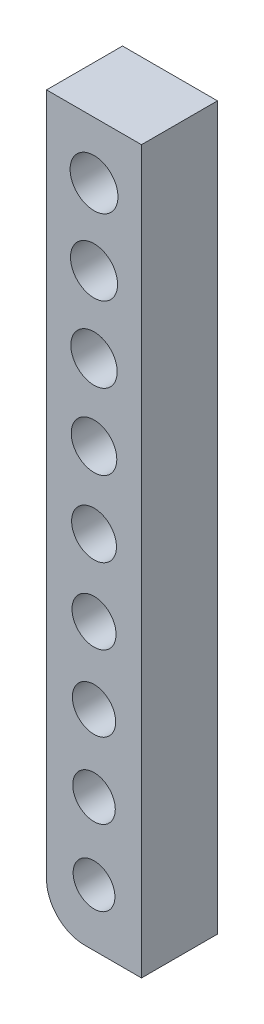
ISO-10303-21;
HEADER;
FILE_DESCRIPTION(('STEP AP214'),'2;1');
FILE_NAME('part.step','',(''),(''),'','','');
FILE_SCHEMA(('AUTOMOTIVE_DESIGN { 1 0 10303 214 1 1 1 1 }'));
ENDSEC;
DATA;
#1=APPLICATION_CONTEXT('core data for automotive mechanical design processes');
#2=APPLICATION_PROTOCOL_DEFINITION('international standard','automotive_design',2000,#1);
#3=PRODUCT_CONTEXT('',#1,'mechanical');
#4=PRODUCT('Part','Part','',(#3));
#5=PRODUCT_RELATED_PRODUCT_CATEGORY('part','',(#4));
#6=PRODUCT_DEFINITION_FORMATION('','',#4);
#7=PRODUCT_DEFINITION_CONTEXT('part definition',#1,'design');
#8=PRODUCT_DEFINITION('design','',#6,#7);
#9=PRODUCT_DEFINITION_SHAPE('','',#8);
#10=(LENGTH_UNIT() NAMED_UNIT(*) SI_UNIT(.MILLI.,.METRE.));
#11=(NAMED_UNIT(*) PLANE_ANGLE_UNIT() SI_UNIT($,.RADIAN.));
#12=(NAMED_UNIT(*) SI_UNIT($,.STERADIAN.) SOLID_ANGLE_UNIT());
#13=UNCERTAINTY_MEASURE_WITH_UNIT(LENGTH_MEASURE(1.E-05),#10,'distance_accuracy_value','');
#14=(GEOMETRIC_REPRESENTATION_CONTEXT(3) GLOBAL_UNCERTAINTY_ASSIGNED_CONTEXT((#13)) GLOBAL_UNIT_ASSIGNED_CONTEXT((#10,
#11,#12)) REPRESENTATION_CONTEXT('',''));
#15=CARTESIAN_POINT('',(0.,0.,0.));
#16=DIRECTION('',(0.,0.,1.));
#17=DIRECTION('',(1.,0.,0.));
#18=AXIS2_PLACEMENT_3D('',#15,#16,#17);
#19=CARTESIAN_POINT('',(0.,0.,5.08));
#20=DIRECTION('',(0.,0.,-1.));
#21=DIRECTION('',(-1.,0.,0.));
#22=AXIS2_PLACEMENT_3D('',#19,#20,#21);
#23=PLANE('',#22);
#24=DIRECTION('',(0.,-1.,0.));
#25=VECTOR('',#24,1.);
#26=CARTESIAN_POINT('',(-6.35,0.,5.08));
#27=LINE('',#26,#25);
#28=CARTESIAN_POINT('',(-6.35,48.26,5.08));
#29=VERTEX_POINT('',#28);
#30=CARTESIAN_POINT('',(-6.35,2.54,5.08));
#31=VERTEX_POINT('',#30);
#32=EDGE_CURVE('E133',#29,#31,#27,.T.);
#33=ORIENTED_EDGE('',*,*,#32,.T.);
#34=CARTESIAN_POINT('',(-3.81,2.54,5.08));
#35=DIRECTION('',(0.,0.,-1.));
#36=DIRECTION('',(-1.,0.,0.));
#37=AXIS2_PLACEMENT_3D('',#34,#35,#36);
#38=CIRCLE('',#37,2.54);
#39=CARTESIAN_POINT('',(-3.81,0.,5.08));
#40=VERTEX_POINT('',#39);
#41=EDGE_CURVE('E11',#31,#40,#38,.F.);
#42=ORIENTED_EDGE('',*,*,#41,.T.);
#43=DIRECTION('',(1.,0.,0.));
#44=VECTOR('',#43,1.);
#45=CARTESIAN_POINT('',(0.,0.,5.08));
#46=LINE('',#45,#44);
#47=CARTESIAN_POINT('',(0.,0.,5.08));
#48=VERTEX_POINT('',#47);
#49=EDGE_CURVE('E92',#40,#48,#46,.T.);
#50=ORIENTED_EDGE('',*,*,#49,.T.);
#51=DIRECTION('',(0.,1.,0.));
#52=VECTOR('',#51,1.);
#53=CARTESIAN_POINT('',(0.,0.,5.08));
#54=LINE('',#53,#52);
#55=CARTESIAN_POINT('',(0.,48.26,5.08));
#56=VERTEX_POINT('',#55);
#57=EDGE_CURVE('E95',#48,#56,#54,.T.);
#58=ORIENTED_EDGE('',*,*,#57,.T.);
#59=DIRECTION('',(-1.,0.,0.));
#60=VECTOR('',#59,1.);
#61=CARTESIAN_POINT('',(0.,48.26,5.08));
#62=LINE('',#61,#60);
#63=EDGE_CURVE('E113',#56,#29,#62,.T.);
#64=ORIENTED_EDGE('',*,*,#63,.T.);
#65=EDGE_LOOP('',(#33,#42,#50,#58,#64));
#66=FACE_BOUND('',#65,.T.);
#67=CARTESIAN_POINT('',(-3.175,3.81,5.08));
#68=DIRECTION('',(0.,0.,1.));
#69=DIRECTION('',(1.,0.,0.));
#70=AXIS2_PLACEMENT_3D('',#67,#68,#69);
#71=CIRCLE('',#70,1.397);
#72=CARTESIAN_POINT('',(-1.778,3.81,5.08));
#73=VERTEX_POINT('',#72);
#74=EDGE_CURVE('E144',#73,#73,#71,.T.);
#75=ORIENTED_EDGE('',*,*,#74,.F.);
#76=EDGE_LOOP('',(#75));
#77=FACE_BOUND('',#76,.T.);
#78=CARTESIAN_POINT('',(-3.175,8.89,5.08));
#79=DIRECTION('',(0.,0.,1.));
#80=DIRECTION('',(1.,0.,0.));
#81=AXIS2_PLACEMENT_3D('',#78,#79,#80);
#82=CIRCLE('',#81,1.4224);
#83=CARTESIAN_POINT('',(-1.7526,8.89,5.08));
#84=VERTEX_POINT('',#83);
#85=EDGE_CURVE('E153',#84,#84,#82,.T.);
#86=ORIENTED_EDGE('',*,*,#85,.F.);
#87=EDGE_LOOP('',(#86));
#88=FACE_BOUND('',#87,.T.);
#89=CARTESIAN_POINT('',(-3.175,13.97,5.08));
#90=DIRECTION('',(0.,0.,1.));
#91=DIRECTION('',(1.,0.,0.));
#92=AXIS2_PLACEMENT_3D('',#89,#90,#91);
#93=CIRCLE('',#92,1.4478);
#94=CARTESIAN_POINT('',(-1.7272,13.97,5.08));
#95=VERTEX_POINT('',#94);
#96=EDGE_CURVE('E161',#95,#95,#93,.T.);
#97=ORIENTED_EDGE('',*,*,#96,.F.);
#98=EDGE_LOOP('',(#97));
#99=FACE_BOUND('',#98,.T.);
#100=CARTESIAN_POINT('',(-3.175,19.05,5.08));
#101=DIRECTION('',(0.,0.,1.));
#102=DIRECTION('',(1.,0.,0.));
#103=AXIS2_PLACEMENT_3D('',#100,#101,#102);
#104=CIRCLE('',#103,1.4732);
#105=CARTESIAN_POINT('',(-1.7018,19.05,5.08));
#106=VERTEX_POINT('',#105);
#107=EDGE_CURVE('E169',#106,#106,#104,.T.);
#108=ORIENTED_EDGE('',*,*,#107,.F.);
#109=EDGE_LOOP('',(#108));
#110=FACE_BOUND('',#109,.T.);
#111=CARTESIAN_POINT('',(-3.175,24.13,5.08));
#112=DIRECTION('',(0.,0.,1.));
#113=DIRECTION('',(1.,0.,0.));
#114=AXIS2_PLACEMENT_3D('',#111,#112,#113);
#115=CIRCLE('',#114,1.4986);
#116=CARTESIAN_POINT('',(-1.6764,24.13,5.08));
#117=VERTEX_POINT('',#116);
#118=EDGE_CURVE('E177',#117,#117,#115,.T.);
#119=ORIENTED_EDGE('',*,*,#118,.F.);
#120=EDGE_LOOP('',(#119));
#121=FACE_BOUND('',#120,.T.);
#122=CARTESIAN_POINT('',(-3.175,29.21,5.08));
#123=DIRECTION('',(0.,0.,1.));
#124=DIRECTION('',(1.,0.,0.));
#125=AXIS2_PLACEMENT_3D('',#122,#123,#124);
#126=CIRCLE('',#125,1.524);
#127=CARTESIAN_POINT('',(-1.651,29.21,5.08));
#128=VERTEX_POINT('',#127);
#129=EDGE_CURVE('E185',#128,#128,#126,.T.);
#130=ORIENTED_EDGE('',*,*,#129,.F.);
#131=EDGE_LOOP('',(#130));
#132=FACE_BOUND('',#131,.T.);
#133=CARTESIAN_POINT('',(-3.175,34.29,5.08));
#134=DIRECTION('',(0.,0.,1.));
#135=DIRECTION('',(1.,0.,0.));
#136=AXIS2_PLACEMENT_3D('',#133,#134,#135);
#137=CIRCLE('',#136,1.5494);
#138=CARTESIAN_POINT('',(-1.6256,34.29,5.08));
#139=VERTEX_POINT('',#138);
#140=EDGE_CURVE('E193',#139,#139,#137,.T.);
#141=ORIENTED_EDGE('',*,*,#140,.F.);
#142=EDGE_LOOP('',(#141));
#143=FACE_BOUND('',#142,.T.);
#144=CARTESIAN_POINT('',(-3.175,39.37,5.08));
#145=DIRECTION('',(0.,0.,1.));
#146=DIRECTION('',(1.,0.,0.));
#147=AXIS2_PLACEMENT_3D('',#144,#145,#146);
#148=CIRCLE('',#147,1.5748);
#149=CARTESIAN_POINT('',(-1.6002,39.37,5.08));
#150=VERTEX_POINT('',#149);
#151=EDGE_CURVE('E201',#150,#150,#148,.T.);
#152=ORIENTED_EDGE('',*,*,#151,.F.);
#153=EDGE_LOOP('',(#152));
#154=FACE_BOUND('',#153,.T.);
#155=CARTESIAN_POINT('',(-3.175,44.45,5.08));
#156=DIRECTION('',(0.,0.,1.));
#157=DIRECTION('',(1.,0.,0.));
#158=AXIS2_PLACEMENT_3D('',#155,#156,#157);
#159=CIRCLE('',#158,1.6002);
#160=CARTESIAN_POINT('',(-1.5748,44.45,5.08));
#161=VERTEX_POINT('',#160);
#162=EDGE_CURVE('E209',#161,#161,#159,.T.);
#163=ORIENTED_EDGE('',*,*,#162,.F.);
#164=EDGE_LOOP('',(#163));
#165=FACE_BOUND('',#164,.T.);
#166=ADVANCED_FACE('F45',(#66,#77,#88,#99,#110,#121,#132,#143,#154,#165),#23,.F.);
#167=CARTESIAN_POINT('',(0.,0.,0.));
#168=DIRECTION('',(0.,0.,-1.));
#169=DIRECTION('',(-1.,0.,0.));
#170=AXIS2_PLACEMENT_3D('',#167,#168,#169);
#171=PLANE('',#170);
#172=CARTESIAN_POINT('',(-3.175,39.37,0.));
#173=DIRECTION('',(0.,0.,1.));
#174=DIRECTION('',(1.,0.,0.));
#175=AXIS2_PLACEMENT_3D('',#172,#173,#174);
#176=CIRCLE('',#175,1.5748);
#177=CARTESIAN_POINT('',(-1.6002,39.37,0.));
#178=VERTEX_POINT('',#177);
#179=EDGE_CURVE('E205',#178,#178,#176,.T.);
#180=ORIENTED_EDGE('',*,*,#179,.T.);
#181=EDGE_LOOP('',(#180));
#182=FACE_BOUND('',#181,.T.);
#183=CARTESIAN_POINT('',(-3.175,29.21,0.));
#184=DIRECTION('',(0.,0.,1.));
#185=DIRECTION('',(1.,0.,0.));
#186=AXIS2_PLACEMENT_3D('',#183,#184,#185);
#187=CIRCLE('',#186,1.524);
#188=CARTESIAN_POINT('',(-1.651,29.21,0.));
#189=VERTEX_POINT('',#188);
#190=EDGE_CURVE('E189',#189,#189,#187,.T.);
#191=ORIENTED_EDGE('',*,*,#190,.T.);
#192=EDGE_LOOP('',(#191));
#193=FACE_BOUND('',#192,.T.);
#194=CARTESIAN_POINT('',(-3.175,19.05,0.));
#195=DIRECTION('',(0.,0.,1.));
#196=DIRECTION('',(1.,0.,0.));
#197=AXIS2_PLACEMENT_3D('',#194,#195,#196);
#198=CIRCLE('',#197,1.4732);
#199=CARTESIAN_POINT('',(-1.7018,19.05,0.));
#200=VERTEX_POINT('',#199);
#201=EDGE_CURVE('E173',#200,#200,#198,.T.);
#202=ORIENTED_EDGE('',*,*,#201,.T.);
#203=EDGE_LOOP('',(#202));
#204=FACE_BOUND('',#203,.T.);
#205=CARTESIAN_POINT('',(-3.175,8.89,0.));
#206=DIRECTION('',(0.,0.,1.));
#207=DIRECTION('',(1.,0.,0.));
#208=AXIS2_PLACEMENT_3D('',#205,#206,#207);
#209=CIRCLE('',#208,1.4224);
#210=CARTESIAN_POINT('',(-1.7526,8.89,0.));
#211=VERTEX_POINT('',#210);
#212=EDGE_CURVE('E157',#211,#211,#209,.T.);
#213=ORIENTED_EDGE('',*,*,#212,.T.);
#214=EDGE_LOOP('',(#213));
#215=FACE_BOUND('',#214,.T.);
#216=DIRECTION('',(1.,0.,0.));
#217=VECTOR('',#216,1.);
#218=CARTESIAN_POINT('',(0.,0.,0.));
#219=LINE('',#218,#217);
#220=CARTESIAN_POINT('',(-3.81,0.,0.));
#221=VERTEX_POINT('',#220);
#222=CARTESIAN_POINT('',(0.,0.,0.));
#223=VERTEX_POINT('',#222);
#224=EDGE_CURVE('E116',#221,#223,#219,.T.);
#225=ORIENTED_EDGE('',*,*,#224,.F.);
#226=CARTESIAN_POINT('',(-3.81,2.54,0.));
#227=DIRECTION('',(0.,0.,-1.));
#228=DIRECTION('',(-1.,0.,0.));
#229=AXIS2_PLACEMENT_3D('',#226,#227,#228);
#230=CIRCLE('',#229,2.54);
#231=CARTESIAN_POINT('',(-6.35,2.54,0.));
#232=VERTEX_POINT('',#231);
#233=EDGE_CURVE('E68',#221,#232,#230,.T.);
#234=ORIENTED_EDGE('',*,*,#233,.T.);
#235=DIRECTION('',(0.,-1.,0.));
#236=VECTOR('',#235,1.);
#237=CARTESIAN_POINT('',(-6.35,0.,0.));
#238=LINE('',#237,#236);
#239=CARTESIAN_POINT('',(-6.35,48.26,0.));
#240=VERTEX_POINT('',#239);
#241=EDGE_CURVE('E103',#240,#232,#238,.T.);
#242=ORIENTED_EDGE('',*,*,#241,.F.);
#243=DIRECTION('',(-1.,0.,0.));
#244=VECTOR('',#243,1.);
#245=CARTESIAN_POINT('',(0.,48.26,0.));
#246=LINE('',#245,#244);
#247=CARTESIAN_POINT('',(0.,48.26,0.));
#248=VERTEX_POINT('',#247);
#249=EDGE_CURVE('E136',#248,#240,#246,.T.);
#250=ORIENTED_EDGE('',*,*,#249,.F.);
#251=DIRECTION('',(0.,1.,0.));
#252=VECTOR('',#251,1.);
#253=CARTESIAN_POINT('',(0.,0.,0.));
#254=LINE('',#253,#252);
#255=EDGE_CURVE('E139',#223,#248,#254,.T.);
#256=ORIENTED_EDGE('',*,*,#255,.F.);
#257=EDGE_LOOP('',(#225,#234,#242,#250,#256));
#258=FACE_BOUND('',#257,.T.);
#259=CARTESIAN_POINT('',(-3.175,3.81,0.));
#260=DIRECTION('',(0.,0.,1.));
#261=DIRECTION('',(1.,0.,0.));
#262=AXIS2_PLACEMENT_3D('',#259,#260,#261);
#263=CIRCLE('',#262,1.397);
#264=CARTESIAN_POINT('',(-1.778,3.81,0.));
#265=VERTEX_POINT('',#264);
#266=EDGE_CURVE('E149',#265,#265,#263,.T.);
#267=ORIENTED_EDGE('',*,*,#266,.T.);
#268=EDGE_LOOP('',(#267));
#269=FACE_BOUND('',#268,.T.);
#270=CARTESIAN_POINT('',(-3.175,13.97,0.));
#271=DIRECTION('',(0.,0.,1.));
#272=DIRECTION('',(1.,0.,0.));
#273=AXIS2_PLACEMENT_3D('',#270,#271,#272);
#274=CIRCLE('',#273,1.4478);
#275=CARTESIAN_POINT('',(-1.7272,13.97,0.));
#276=VERTEX_POINT('',#275);
#277=EDGE_CURVE('E165',#276,#276,#274,.T.);
#278=ORIENTED_EDGE('',*,*,#277,.T.);
#279=EDGE_LOOP('',(#278));
#280=FACE_BOUND('',#279,.T.);
#281=CARTESIAN_POINT('',(-3.175,24.13,0.));
#282=DIRECTION('',(0.,0.,1.));
#283=DIRECTION('',(1.,0.,0.));
#284=AXIS2_PLACEMENT_3D('',#281,#282,#283);
#285=CIRCLE('',#284,1.4986);
#286=CARTESIAN_POINT('',(-1.6764,24.13,0.));
#287=VERTEX_POINT('',#286);
#288=EDGE_CURVE('E181',#287,#287,#285,.T.);
#289=ORIENTED_EDGE('',*,*,#288,.T.);
#290=EDGE_LOOP('',(#289));
#291=FACE_BOUND('',#290,.T.);
#292=CARTESIAN_POINT('',(-3.175,34.29,0.));
#293=DIRECTION('',(0.,0.,1.));
#294=DIRECTION('',(1.,0.,0.));
#295=AXIS2_PLACEMENT_3D('',#292,#293,#294);
#296=CIRCLE('',#295,1.5494);
#297=CARTESIAN_POINT('',(-1.6256,34.29,0.));
#298=VERTEX_POINT('',#297);
#299=EDGE_CURVE('E197',#298,#298,#296,.T.);
#300=ORIENTED_EDGE('',*,*,#299,.T.);
#301=EDGE_LOOP('',(#300));
#302=FACE_BOUND('',#301,.T.);
#303=CARTESIAN_POINT('',(-3.175,44.45,0.));
#304=DIRECTION('',(0.,0.,1.));
#305=DIRECTION('',(1.,0.,0.));
#306=AXIS2_PLACEMENT_3D('',#303,#304,#305);
#307=CIRCLE('',#306,1.6002);
#308=CARTESIAN_POINT('',(-1.5748,44.45,0.));
#309=VERTEX_POINT('',#308);
#310=EDGE_CURVE('E213',#309,#309,#307,.T.);
#311=ORIENTED_EDGE('',*,*,#310,.T.);
#312=EDGE_LOOP('',(#311));
#313=FACE_BOUND('',#312,.T.);
#314=ADVANCED_FACE('F225',(#182,#193,#204,#215,#258,#269,#280,#291,#302,#313),#171,.T.);
#315=CARTESIAN_POINT('',(0.,0.,5.08));
#316=DIRECTION('',(0.,1.,0.));
#317=DIRECTION('',(0.,0.,1.));
#318=AXIS2_PLACEMENT_3D('',#315,#316,#317);
#319=PLANE('',#318);
#320=ORIENTED_EDGE('',*,*,#49,.F.);
#321=DIRECTION('',(0.,0.,-1.));
#322=VECTOR('',#321,1.);
#323=CARTESIAN_POINT('',(-3.81,0.,5.08));
#324=LINE('',#323,#322);
#325=EDGE_CURVE('E119',#40,#221,#324,.T.);
#326=ORIENTED_EDGE('',*,*,#325,.T.);
#327=ORIENTED_EDGE('',*,*,#224,.T.);
#328=DIRECTION('',(0.,0.,-1.));
#329=VECTOR('',#328,1.);
#330=CARTESIAN_POINT('',(0.,0.,5.08));
#331=LINE('',#330,#329);
#332=EDGE_CURVE('E108',#48,#223,#331,.T.);
#333=ORIENTED_EDGE('',*,*,#332,.F.);
#334=EDGE_LOOP('',(#320,#326,#327,#333));
#335=FACE_BOUND('',#334,.T.);
#336=ADVANCED_FACE('F115',(#335),#319,.F.);
#337=CARTESIAN_POINT('',(0.,0.,5.08));
#338=DIRECTION('',(-1.,0.,0.));
#339=DIRECTION('',(0.,0.,1.));
#340=AXIS2_PLACEMENT_3D('',#337,#338,#339);
#341=PLANE('',#340);
#342=ORIENTED_EDGE('',*,*,#255,.T.);
#343=DIRECTION('',(0.,0.,-1.));
#344=VECTOR('',#343,1.);
#345=CARTESIAN_POINT('',(0.,48.26,5.08));
#346=LINE('',#345,#344);
#347=EDGE_CURVE('E110',#56,#248,#346,.T.);
#348=ORIENTED_EDGE('',*,*,#347,.F.);
#349=ORIENTED_EDGE('',*,*,#57,.F.);
#350=ORIENTED_EDGE('',*,*,#332,.T.);
#351=EDGE_LOOP('',(#342,#348,#349,#350));
#352=FACE_BOUND('',#351,.T.);
#353=ADVANCED_FACE('F107',(#352),#341,.F.);
#354=CARTESIAN_POINT('',(0.,48.26,5.08));
#355=DIRECTION('',(0.,-1.,0.));
#356=DIRECTION('',(0.,0.,-1.));
#357=AXIS2_PLACEMENT_3D('',#354,#355,#356);
#358=PLANE('',#357);
#359=ORIENTED_EDGE('',*,*,#249,.T.);
#360=DIRECTION('',(0.,0.,-1.));
#361=VECTOR('',#360,1.);
#362=CARTESIAN_POINT('',(-6.35,48.26,5.08));
#363=LINE('',#362,#361);
#364=EDGE_CURVE('E124',#29,#240,#363,.T.);
#365=ORIENTED_EDGE('',*,*,#364,.F.);
#366=ORIENTED_EDGE('',*,*,#63,.F.);
#367=ORIENTED_EDGE('',*,*,#347,.T.);
#368=EDGE_LOOP('',(#359,#365,#366,#367));
#369=FACE_BOUND('',#368,.T.);
#370=ADVANCED_FACE('F240',(#369),#358,.F.);
#371=CARTESIAN_POINT('',(-6.35,0.,5.08));
#372=DIRECTION('',(1.,0.,0.));
#373=DIRECTION('',(0.,0.,-1.));
#374=AXIS2_PLACEMENT_3D('',#371,#372,#373);
#375=PLANE('',#374);
#376=ORIENTED_EDGE('',*,*,#241,.T.);
#377=DIRECTION('',(0.,0.,-1.));
#378=VECTOR('',#377,1.);
#379=CARTESIAN_POINT('',(-6.35,2.54,5.08));
#380=LINE('',#379,#378);
#381=EDGE_CURVE('E54',#232,#31,#380,.F.);
#382=ORIENTED_EDGE('',*,*,#381,.T.);
#383=ORIENTED_EDGE('',*,*,#32,.F.);
#384=ORIENTED_EDGE('',*,*,#364,.T.);
#385=EDGE_LOOP('',(#376,#382,#383,#384));
#386=FACE_BOUND('',#385,.T.);
#387=ADVANCED_FACE('F237',(#386),#375,.F.);
#388=CARTESIAN_POINT('',(-3.175,3.81,5.08));
#389=DIRECTION('',(0.,0.,-1.));
#390=DIRECTION('',(-1.,0.,0.));
#391=AXIS2_PLACEMENT_3D('',#388,#389,#390);
#392=CYLINDRICAL_SURFACE('',#391,1.397);
#393=ORIENTED_EDGE('',*,*,#74,.T.);
#394=EDGE_LOOP('',(#393));
#395=FACE_BOUND('',#394,.T.);
#396=ORIENTED_EDGE('',*,*,#266,.F.);
#397=EDGE_LOOP('',(#396));
#398=FACE_BOUND('',#397,.T.);
#399=ADVANCED_FACE('F234',(#395,#398),#392,.F.);
#400=CARTESIAN_POINT('',(-3.175,8.89,5.08));
#401=DIRECTION('',(0.,0.,-1.));
#402=DIRECTION('',(-1.,0.,0.));
#403=AXIS2_PLACEMENT_3D('',#400,#401,#402);
#404=CYLINDRICAL_SURFACE('',#403,1.4224);
#405=ORIENTED_EDGE('',*,*,#85,.T.);
#406=EDGE_LOOP('',(#405));
#407=FACE_BOUND('',#406,.T.);
#408=ORIENTED_EDGE('',*,*,#212,.F.);
#409=EDGE_LOOP('',(#408));
#410=FACE_BOUND('',#409,.T.);
#411=ADVANCED_FACE('F333',(#407,#410),#404,.F.);
#412=CARTESIAN_POINT('',(-3.175,13.97,5.08));
#413=DIRECTION('',(0.,0.,-1.));
#414=DIRECTION('',(-1.,0.,0.));
#415=AXIS2_PLACEMENT_3D('',#412,#413,#414);
#416=CYLINDRICAL_SURFACE('',#415,1.4478);
#417=ORIENTED_EDGE('',*,*,#96,.T.);
#418=EDGE_LOOP('',(#417));
#419=FACE_BOUND('',#418,.T.);
#420=ORIENTED_EDGE('',*,*,#277,.F.);
#421=EDGE_LOOP('',(#420));
#422=FACE_BOUND('',#421,.T.);
#423=ADVANCED_FACE('F323',(#419,#422),#416,.F.);
#424=CARTESIAN_POINT('',(-3.175,19.05,5.08));
#425=DIRECTION('',(0.,0.,-1.));
#426=DIRECTION('',(-1.,0.,0.));
#427=AXIS2_PLACEMENT_3D('',#424,#425,#426);
#428=CYLINDRICAL_SURFACE('',#427,1.4732);
#429=ORIENTED_EDGE('',*,*,#107,.T.);
#430=EDGE_LOOP('',(#429));
#431=FACE_BOUND('',#430,.T.);
#432=ORIENTED_EDGE('',*,*,#201,.F.);
#433=EDGE_LOOP('',(#432));
#434=FACE_BOUND('',#433,.T.);
#435=ADVANCED_FACE('F313',(#431,#434),#428,.F.);
#436=CARTESIAN_POINT('',(-3.175,24.13,5.08));
#437=DIRECTION('',(0.,0.,-1.));
#438=DIRECTION('',(-1.,0.,0.));
#439=AXIS2_PLACEMENT_3D('',#436,#437,#438);
#440=CYLINDRICAL_SURFACE('',#439,1.4986);
#441=ORIENTED_EDGE('',*,*,#118,.T.);
#442=EDGE_LOOP('',(#441));
#443=FACE_BOUND('',#442,.T.);
#444=ORIENTED_EDGE('',*,*,#288,.F.);
#445=EDGE_LOOP('',(#444));
#446=FACE_BOUND('',#445,.T.);
#447=ADVANCED_FACE('F303',(#443,#446),#440,.F.);
#448=CARTESIAN_POINT('',(-3.175,29.21,5.08));
#449=DIRECTION('',(0.,0.,-1.));
#450=DIRECTION('',(-1.,0.,0.));
#451=AXIS2_PLACEMENT_3D('',#448,#449,#450);
#452=CYLINDRICAL_SURFACE('',#451,1.524);
#453=ORIENTED_EDGE('',*,*,#129,.T.);
#454=EDGE_LOOP('',(#453));
#455=FACE_BOUND('',#454,.T.);
#456=ORIENTED_EDGE('',*,*,#190,.F.);
#457=EDGE_LOOP('',(#456));
#458=FACE_BOUND('',#457,.T.);
#459=ADVANCED_FACE('F293',(#455,#458),#452,.F.);
#460=CARTESIAN_POINT('',(-3.175,34.29,5.08));
#461=DIRECTION('',(0.,0.,-1.));
#462=DIRECTION('',(-1.,0.,0.));
#463=AXIS2_PLACEMENT_3D('',#460,#461,#462);
#464=CYLINDRICAL_SURFACE('',#463,1.5494);
#465=ORIENTED_EDGE('',*,*,#140,.T.);
#466=EDGE_LOOP('',(#465));
#467=FACE_BOUND('',#466,.T.);
#468=ORIENTED_EDGE('',*,*,#299,.F.);
#469=EDGE_LOOP('',(#468));
#470=FACE_BOUND('',#469,.T.);
#471=ADVANCED_FACE('F283',(#467,#470),#464,.F.);
#472=CARTESIAN_POINT('',(-3.175,39.37,5.08));
#473=DIRECTION('',(0.,0.,-1.));
#474=DIRECTION('',(-1.,0.,0.));
#475=AXIS2_PLACEMENT_3D('',#472,#473,#474);
#476=CYLINDRICAL_SURFACE('',#475,1.5748);
#477=ORIENTED_EDGE('',*,*,#151,.T.);
#478=EDGE_LOOP('',(#477));
#479=FACE_BOUND('',#478,.T.);
#480=ORIENTED_EDGE('',*,*,#179,.F.);
#481=EDGE_LOOP('',(#480));
#482=FACE_BOUND('',#481,.T.);
#483=ADVANCED_FACE('F274',(#479,#482),#476,.F.);
#484=CARTESIAN_POINT('',(-3.175,44.45,5.08));
#485=DIRECTION('',(0.,0.,-1.));
#486=DIRECTION('',(-1.,0.,0.));
#487=AXIS2_PLACEMENT_3D('',#484,#485,#486);
#488=CYLINDRICAL_SURFACE('',#487,1.6002);
#489=ORIENTED_EDGE('',*,*,#162,.T.);
#490=EDGE_LOOP('',(#489));
#491=FACE_BOUND('',#490,.T.);
#492=ORIENTED_EDGE('',*,*,#310,.F.);
#493=EDGE_LOOP('',(#492));
#494=FACE_BOUND('',#493,.T.);
#495=ADVANCED_FACE('F221',(#491,#494),#488,.F.);
#496=CARTESIAN_POINT('',(-3.81,2.54,5.08));
#497=DIRECTION('',(0.,0.,-1.));
#498=DIRECTION('',(-1.,0.,0.));
#499=AXIS2_PLACEMENT_3D('',#496,#497,#498);
#500=CYLINDRICAL_SURFACE('',#499,2.54);
#501=ORIENTED_EDGE('',*,*,#41,.F.);
#502=ORIENTED_EDGE('',*,*,#381,.F.);
#503=ORIENTED_EDGE('',*,*,#233,.F.);
#504=ORIENTED_EDGE('',*,*,#325,.F.);
#505=EDGE_LOOP('',(#501,#502,#503,#504));
#506=FACE_BOUND('',#505,.T.);
#507=ADVANCED_FACE('F47',(#506),#500,.T.);
#508=CLOSED_SHELL('',(#166,#314,#336,#353,#370,#387,#399,#411,#423,#435,#447,#459,#471,#483,
#495,#507));
#509=MANIFOLD_SOLID_BREP('B2',#508);
#510=ADVANCED_BREP_SHAPE_REPRESENTATION('',(#18,#509),#14);
#511=SHAPE_DEFINITION_REPRESENTATION(#9,#510);
ENDSEC;
END-ISO-10303-21;
